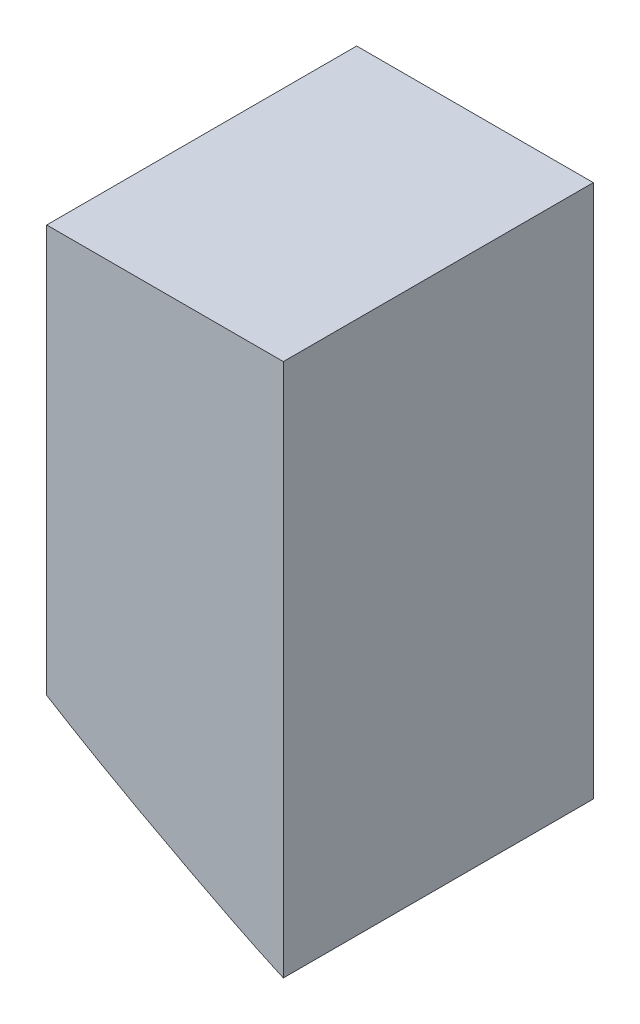
ISO-10303-21;
HEADER;
FILE_DESCRIPTION(('STEP AP214'),'2;1');
FILE_NAME('part.step','',(''),(''),'','','');
FILE_SCHEMA(('AUTOMOTIVE_DESIGN { 1 0 10303 214 1 1 1 1 }'));
ENDSEC;
DATA;
#1=APPLICATION_CONTEXT('core data for automotive mechanical design processes');
#2=APPLICATION_PROTOCOL_DEFINITION('international standard','automotive_design',2000,#1);
#3=PRODUCT_CONTEXT('',#1,'mechanical');
#4=PRODUCT('Part','Part','',(#3));
#5=PRODUCT_RELATED_PRODUCT_CATEGORY('part','',(#4));
#6=PRODUCT_DEFINITION_FORMATION('','',#4);
#7=PRODUCT_DEFINITION_CONTEXT('part definition',#1,'design');
#8=PRODUCT_DEFINITION('design','',#6,#7);
#9=PRODUCT_DEFINITION_SHAPE('','',#8);
#10=(LENGTH_UNIT() NAMED_UNIT(*) SI_UNIT(.MILLI.,.METRE.));
#11=(NAMED_UNIT(*) PLANE_ANGLE_UNIT() SI_UNIT($,.RADIAN.));
#12=(NAMED_UNIT(*) SI_UNIT($,.STERADIAN.) SOLID_ANGLE_UNIT());
#13=UNCERTAINTY_MEASURE_WITH_UNIT(LENGTH_MEASURE(1.E-05),#10,'distance_accuracy_value','');
#14=(GEOMETRIC_REPRESENTATION_CONTEXT(3) GLOBAL_UNCERTAINTY_ASSIGNED_CONTEXT((#13)) GLOBAL_UNIT_ASSIGNED_CONTEXT((#10,
#11,#12)) REPRESENTATION_CONTEXT('',''));
#15=CARTESIAN_POINT('',(0.,0.,0.));
#16=DIRECTION('',(0.,0.,1.));
#17=DIRECTION('',(1.,0.,0.));
#18=AXIS2_PLACEMENT_3D('',#15,#16,#17);
#19=CARTESIAN_POINT('',(-452.259550584509,1945.80608555857,35.9999999999997));
#20=CARTESIAN_POINT('',(-75.5224909268142,1296.65871024278,35.9999999999997));
#21=CARTESIAN_POINT('',(-75.9835615632466,647.510524596485,35.9999999999997));
#22=CARTESIAN_POINT('',(-75.9901733588098,-2.67872438043271,35.9999999999997));
#23=CARTESIAN_POINT('',(-75.9901831395752,-3.71979056151745,35.9999999999997));
#24=CARTESIAN_POINT('',(-75.9915705620727,-574.698606672594,35.9999999999997));
#25=CARTESIAN_POINT('',(-72.7208844885087,-1144.63636204912,35.9999999999997));
#26=CARTESIAN_POINT('',(-935.188901673515,-1714.55226797023,35.9999999999997));
#27=B_SPLINE_CURVE_WITH_KNOTS('',3,(#19,#20,#21,#22,#23,#24,#25,#26),.UNSPECIFIED.,.F.,.F.,(4,2,
2,4),(-175.117052158632,24.7467426299615,25.0672725845861,200.543264833963),.UNSPECIFIED.);
#28=DIRECTION('',(0.,0.,1.));
#29=VECTOR('',#28,1.);
#30=SURFACE_OF_LINEAR_EXTRUSION('',#27,#29);
#31=CARTESIAN_POINT('',(-75.9901605328119,-8.25831821951877,43.9999999999997));
#32=CARTESIAN_POINT('',(-75.9901776440467,-7.0924977273167,43.9999999999997));
#33=CARTESIAN_POINT('',(-75.9901885020933,-5.92667723495036,43.9999999999997));
#34=CARTESIAN_POINT('',(-75.9901831395752,-3.71979056151745,43.9999999999997));
#35=CARTESIAN_POINT('',(-75.9901733588098,-2.67872438043271,43.9999999999997));
#36=CARTESIAN_POINT('',(-75.9901495739285,-0.339772132912525,43.9999999999997));
#37=CARTESIAN_POINT('',(-75.9901345589541,0.958113933541545,43.9999999999997));
#38=CARTESIAN_POINT('',(-75.9901207456081,2.25600000000051,43.9999999999997));
#39=B_SPLINE_CURVE_WITH_KNOTS('',3,(#31,#32,#33,#34,#35,#36,#37,#38),.UNSPECIFIED.,.F.,.F.,(4,2,
2,4),(24.3471413658476,24.7060814565922,25.0266114112168,25.4262126753307),.UNSPECIFIED.);
#40=CARTESIAN_POINT('',(-75.9901206831481,2.25600000000002,43.9999999999997));
#41=VERTEX_POINT('',#40);
#42=CARTESIAN_POINT('',(-75.9901605328119,-8.25831821951876,43.9999999999997));
#43=VERTEX_POINT('',#42);
#44=EDGE_CURVE('E189',#41,#43,#39,.F.);
#45=ORIENTED_EDGE('',*,*,#44,.F.);
#46=DIRECTION('',(0.,0.,1.));
#47=VECTOR('',#46,1.);
#48=CARTESIAN_POINT('',(-75.9901206831481,2.25600000000002,35.9999999999997));
#49=LINE('',#48,#47);
#50=CARTESIAN_POINT('',(-75.9901206831481,2.25600000000002,35.9999999999997));
#51=VERTEX_POINT('',#50);
#52=EDGE_CURVE('E11',#51,#41,#49,.T.);
#53=ORIENTED_EDGE('',*,*,#52,.F.);
#54=CARTESIAN_POINT('',(-75.9901207456081,2.25600000000051,35.9999999999997));
#55=CARTESIAN_POINT('',(-75.9901345589541,0.958113933541545,35.9999999999997));
#56=CARTESIAN_POINT('',(-75.9901495739285,-0.339772132912525,35.9999999999997));
#57=CARTESIAN_POINT('',(-75.9901733588098,-2.67872438043271,35.9999999999997));
#58=CARTESIAN_POINT('',(-75.9901831395752,-3.71979056151745,35.9999999999997));
#59=CARTESIAN_POINT('',(-75.9901885020933,-5.92667723495036,35.9999999999997));
#60=CARTESIAN_POINT('',(-75.9901776440467,-7.0924977273167,35.9999999999997));
#61=CARTESIAN_POINT('',(-75.9901605328119,-8.25831821951877,35.9999999999997));
#62=B_SPLINE_CURVE_WITH_KNOTS('',3,(#54,#55,#56,#57,#58,#59,#60,#61),.UNSPECIFIED.,.F.,.F.,(4,2,
2,4),(24.3471413658476,24.7467426299615,25.0672725845861,25.4262126753307),.UNSPECIFIED.);
#63=CARTESIAN_POINT('',(-75.9901605328119,-8.25831821951876,35.9999999999997));
#64=VERTEX_POINT('',#63);
#65=EDGE_CURVE('E94',#51,#64,#62,.T.);
#66=ORIENTED_EDGE('',*,*,#65,.T.);
#67=DIRECTION('',(0.,0.,1.));
#68=VECTOR('',#67,1.);
#69=CARTESIAN_POINT('',(-75.9901605328119,-8.25831821951876,35.9999999999997));
#70=LINE('',#69,#68);
#71=EDGE_CURVE('E75',#64,#43,#70,.T.);
#72=ORIENTED_EDGE('',*,*,#71,.T.);
#73=EDGE_LOOP('',(#45,#53,#66,#72));
#74=FACE_BOUND('',#73,.T.);
#75=ADVANCED_FACE('F30',(#74),#30,.T.);
#76=CARTESIAN_POINT('',(-69.8827461862011,2.25600000000001,35.9999999999997));
#77=DIRECTION('',(0.,1.,0.));
#78=DIRECTION('',(-1.,0.,0.));
#79=AXIS2_PLACEMENT_3D('',#76,#77,#78);
#80=PLANE('',#79);
#81=DIRECTION('',(-1.,0.,0.));
#82=VECTOR('',#81,1.);
#83=CARTESIAN_POINT('',(-69.8827461862011,2.25600000000001,43.9999999999997));
#84=LINE('',#83,#82);
#85=CARTESIAN_POINT('',(-69.8827461862011,2.25600000000001,43.9999999999997));
#86=VERTEX_POINT('',#85);
#87=EDGE_CURVE('E135',#86,#41,#84,.T.);
#88=ORIENTED_EDGE('',*,*,#87,.F.);
#89=DIRECTION('',(0.,0.,1.));
#90=VECTOR('',#89,1.);
#91=CARTESIAN_POINT('',(-69.8827461862011,2.25600000000001,35.9999999999997));
#92=LINE('',#91,#90);
#93=CARTESIAN_POINT('',(-69.8827461862011,2.25600000000001,35.9999999999997));
#94=VERTEX_POINT('',#93);
#95=EDGE_CURVE('E41',#94,#86,#92,.T.);
#96=ORIENTED_EDGE('',*,*,#95,.F.);
#97=DIRECTION('',(-1.,0.,0.));
#98=VECTOR('',#97,1.);
#99=CARTESIAN_POINT('',(-69.8827461862011,2.25600000000001,35.9999999999997));
#100=LINE('',#99,#98);
#101=EDGE_CURVE('E90',#94,#51,#100,.T.);
#102=ORIENTED_EDGE('',*,*,#101,.T.);
#103=ORIENTED_EDGE('',*,*,#52,.T.);
#104=EDGE_LOOP('',(#88,#96,#102,#103));
#105=FACE_BOUND('',#104,.T.);
#106=ADVANCED_FACE('F212',(#105),#80,.T.);
#107=CARTESIAN_POINT('',(-69.8827442780941,-11.521614680451,35.9999999999997));
#108=DIRECTION('',(0.99999999999999,1.38493278970523E-07,0.));
#109=DIRECTION('',(-1.38493278970523E-07,0.99999999999999,0.));
#110=AXIS2_PLACEMENT_3D('',#107,#108,#109);
#111=PLANE('',#110);
#112=DIRECTION('',(-1.38493278970523E-07,0.99999999999999,0.));
#113=VECTOR('',#112,1.);
#114=CARTESIAN_POINT('',(-69.8827442780941,-11.521614680451,43.9999999999997));
#115=LINE('',#114,#113);
#116=CARTESIAN_POINT('',(-69.8827442780941,-11.521614680451,43.9999999999997));
#117=VERTEX_POINT('',#116);
#118=EDGE_CURVE('E83',#117,#86,#115,.T.);
#119=ORIENTED_EDGE('',*,*,#118,.F.);
#120=DIRECTION('',(0.,0.,1.));
#121=VECTOR('',#120,1.);
#122=CARTESIAN_POINT('',(-69.8827442780941,-11.521614680451,35.9999999999997));
#123=LINE('',#122,#121);
#124=CARTESIAN_POINT('',(-69.8827442780941,-11.521614680451,35.9999999999997));
#125=VERTEX_POINT('',#124);
#126=EDGE_CURVE('E78',#125,#117,#123,.T.);
#127=ORIENTED_EDGE('',*,*,#126,.F.);
#128=DIRECTION('',(-1.38493278970523E-07,0.99999999999999,0.));
#129=VECTOR('',#128,1.);
#130=CARTESIAN_POINT('',(-69.8827442780941,-11.521614680451,35.9999999999997));
#131=LINE('',#130,#129);
#132=EDGE_CURVE('E81',#125,#94,#131,.T.);
#133=ORIENTED_EDGE('',*,*,#132,.T.);
#134=ORIENTED_EDGE('',*,*,#95,.T.);
#135=EDGE_LOOP('',(#119,#127,#133,#134));
#136=FACE_BOUND('',#135,.T.);
#137=ADVANCED_FACE('F80',(#136),#111,.T.);
#138=CARTESIAN_POINT('',(-75.9901605328119,-8.25831821951876,35.9999999999997));
#139=CARTESIAN_POINT('',(-75.4986581177567,-8.56139627193514,35.9999999999997));
#140=CARTESIAN_POINT('',(-75.0014482415572,-8.85490722852235,35.9999999999997));
#141=CARTESIAN_POINT('',(-73.9965880548737,-9.42442842942354,35.9999999999997));
#142=CARTESIAN_POINT('',(-73.4887455737496,-9.70016203109138,35.9999999999997));
#143=CARTESIAN_POINT('',(-72.4685196951546,-10.2438324943406,35.9999999999997));
#144=CARTESIAN_POINT('',(-71.9568849187278,-10.5121498096404,35.9999999999997));
#145=CARTESIAN_POINT('',(-70.9276658901374,-11.0350314850683,35.9999999999997));
#146=CARTESIAN_POINT('',(-70.410049822355,-11.2895222994255,35.9999999999997));
#147=CARTESIAN_POINT('',(-69.8827442780941,-11.521614680451,35.9999999999997));
#148=B_SPLINE_CURVE_WITH_KNOTS('',3,(#138,#139,#140,#141,#142,#143,#144,#145,#146,#147),
.UNSPECIFIED.,.F.,.F.,(4,2,2,2,4),(0.,0.25,0.5,0.75,1.),.UNSPECIFIED.);
#149=DIRECTION('',(0.,0.,1.));
#150=VECTOR('',#149,1.);
#151=SURFACE_OF_LINEAR_EXTRUSION('',#148,#150);
#152=CARTESIAN_POINT('',(-69.8827442780941,-11.521614680451,43.9999999999997));
#153=CARTESIAN_POINT('',(-70.410049822355,-11.2895222994255,43.9999999999997));
#154=CARTESIAN_POINT('',(-70.9276658901374,-11.0350314850683,43.9999999999997));
#155=CARTESIAN_POINT('',(-71.9568849187278,-10.5121498096404,43.9999999999997));
#156=CARTESIAN_POINT('',(-72.4685196951546,-10.2438324943406,43.9999999999997));
#157=CARTESIAN_POINT('',(-73.4887455737496,-9.70016203109138,43.9999999999997));
#158=CARTESIAN_POINT('',(-73.9965880548737,-9.42442842942354,43.9999999999997));
#159=CARTESIAN_POINT('',(-75.0014482415572,-8.85490722852235,43.9999999999997));
#160=CARTESIAN_POINT('',(-75.4986581177567,-8.56139627193514,43.9999999999997));
#161=CARTESIAN_POINT('',(-75.9901605328119,-8.25831821951876,43.9999999999997));
#162=B_SPLINE_CURVE_WITH_KNOTS('',3,(#152,#153,#154,#155,#156,#157,#158,#159,#160,#161),
.UNSPECIFIED.,.F.,.F.,(4,2,2,2,4),(0.,0.25,0.5,0.75,1.),.UNSPECIFIED.);
#163=EDGE_CURVE('E136',#43,#117,#162,.F.);
#164=ORIENTED_EDGE('',*,*,#163,.F.);
#165=ORIENTED_EDGE('',*,*,#71,.F.);
#166=CARTESIAN_POINT('',(-75.9901605328119,-8.25831821951876,35.9999999999997));
#167=CARTESIAN_POINT('',(-75.4986581177567,-8.56139627193514,35.9999999999997));
#168=CARTESIAN_POINT('',(-75.0014482415572,-8.85490722852235,35.9999999999997));
#169=CARTESIAN_POINT('',(-73.9965880548737,-9.42442842942354,35.9999999999997));
#170=CARTESIAN_POINT('',(-73.4887455737496,-9.70016203109138,35.9999999999997));
#171=CARTESIAN_POINT('',(-72.4685196951546,-10.2438324943406,35.9999999999997));
#172=CARTESIAN_POINT('',(-71.9568849187278,-10.5121498096404,35.9999999999997));
#173=CARTESIAN_POINT('',(-70.9276658901374,-11.0350314850683,35.9999999999997));
#174=CARTESIAN_POINT('',(-70.410049822355,-11.2895222994255,35.9999999999997));
#175=CARTESIAN_POINT('',(-69.8827442780941,-11.521614680451,35.9999999999997));
#176=B_SPLINE_CURVE_WITH_KNOTS('',3,(#166,#167,#168,#169,#170,#171,#172,#173,#174,#175),
.UNSPECIFIED.,.F.,.F.,(4,2,2,2,4),(0.,0.25,0.5,0.75,1.),.UNSPECIFIED.);
#177=EDGE_CURVE('E88',#64,#125,#176,.T.);
#178=ORIENTED_EDGE('',*,*,#177,.T.);
#179=ORIENTED_EDGE('',*,*,#126,.T.);
#180=EDGE_LOOP('',(#164,#165,#178,#179));
#181=FACE_BOUND('',#180,.T.);
#182=ADVANCED_FACE('F93',(#181),#151,.T.);
#183=CARTESIAN_POINT('',(-76.0664569914033,115.616391691073,35.9999999999997));
#184=DIRECTION('',(0.,0.,-1.));
#185=DIRECTION('',(-1.,0.,0.));
#186=AXIS2_PLACEMENT_3D('',#183,#184,#185);
#187=PLANE('',#186);
#188=ORIENTED_EDGE('',*,*,#65,.F.);
#189=ORIENTED_EDGE('',*,*,#101,.F.);
#190=ORIENTED_EDGE('',*,*,#132,.F.);
#191=ORIENTED_EDGE('',*,*,#177,.F.);
#192=EDGE_LOOP('',(#188,#189,#190,#191));
#193=FACE_BOUND('',#192,.T.);
#194=ADVANCED_FACE('F87',(#193),#187,.T.);
#195=CARTESIAN_POINT('',(-76.0664569914033,115.616391691073,43.9999999999997));
#196=DIRECTION('',(0.,0.,-1.));
#197=DIRECTION('',(-1.,0.,0.));
#198=AXIS2_PLACEMENT_3D('',#195,#196,#197);
#199=PLANE('',#198);
#200=ORIENTED_EDGE('',*,*,#44,.T.);
#201=ORIENTED_EDGE('',*,*,#163,.T.);
#202=ORIENTED_EDGE('',*,*,#118,.T.);
#203=ORIENTED_EDGE('',*,*,#87,.T.);
#204=EDGE_LOOP('',(#200,#201,#202,#203));
#205=FACE_BOUND('',#204,.T.);
#206=ADVANCED_FACE('F161',(#205),#199,.F.);
#207=CLOSED_SHELL('',(#75,#106,#137,#182,#194,#206));
#208=MANIFOLD_SOLID_BREP('B2',#207);
#209=ADVANCED_BREP_SHAPE_REPRESENTATION('',(#18,#208),#14);
#210=SHAPE_DEFINITION_REPRESENTATION(#9,#209);
ENDSEC;
END-ISO-10303-21;
